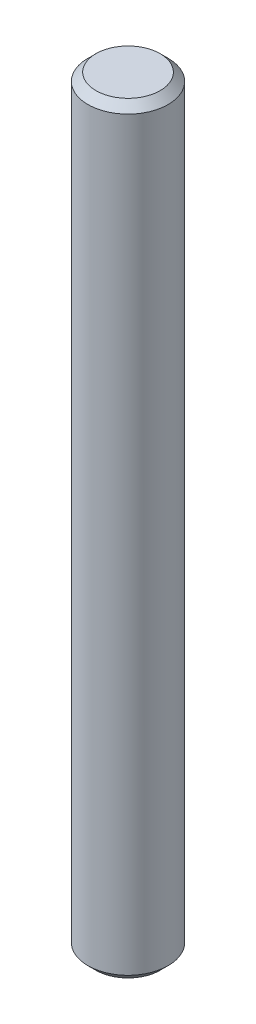
ISO-10303-21;
HEADER;
FILE_DESCRIPTION(('STEP AP214'),'2;1');
FILE_NAME('part.step','',(''),(''),'','','');
FILE_SCHEMA(('AUTOMOTIVE_DESIGN { 1 0 10303 214 1 1 1 1 }'));
ENDSEC;
DATA;
#1=APPLICATION_CONTEXT('core data for automotive mechanical design processes');
#2=APPLICATION_PROTOCOL_DEFINITION('international standard','automotive_design',2000,#1);
#3=PRODUCT_CONTEXT('',#1,'mechanical');
#4=PRODUCT('Part','Part','',(#3));
#5=PRODUCT_RELATED_PRODUCT_CATEGORY('part','',(#4));
#6=PRODUCT_DEFINITION_FORMATION('','',#4);
#7=PRODUCT_DEFINITION_CONTEXT('part definition',#1,'design');
#8=PRODUCT_DEFINITION('design','',#6,#7);
#9=PRODUCT_DEFINITION_SHAPE('','',#8);
#10=(LENGTH_UNIT() NAMED_UNIT(*) SI_UNIT(.MILLI.,.METRE.));
#11=(NAMED_UNIT(*) PLANE_ANGLE_UNIT() SI_UNIT($,.RADIAN.));
#12=(NAMED_UNIT(*) SI_UNIT($,.STERADIAN.) SOLID_ANGLE_UNIT());
#13=UNCERTAINTY_MEASURE_WITH_UNIT(LENGTH_MEASURE(1.E-05),#10,'distance_accuracy_value','');
#14=(GEOMETRIC_REPRESENTATION_CONTEXT(3) GLOBAL_UNCERTAINTY_ASSIGNED_CONTEXT((#13)) GLOBAL_UNIT_ASSIGNED_CONTEXT((#10,
#11,#12)) REPRESENTATION_CONTEXT('',''));
#15=CARTESIAN_POINT('',(0.,0.,0.));
#16=DIRECTION('',(0.,0.,1.));
#17=DIRECTION('',(1.,0.,0.));
#18=AXIS2_PLACEMENT_3D('',#15,#16,#17);
#19=CARTESIAN_POINT('',(-1107.44,320.675,-1549.4));
#20=DIRECTION('',(0.,-1.,0.));
#21=DIRECTION('',(0.,0.,-1.));
#22=AXIS2_PLACEMENT_3D('',#19,#20,#21);
#23=CYLINDRICAL_SURFACE('',#22,3.17499999999983);
#24=CARTESIAN_POINT('',(-1107.44,260.985,-1549.4));
#25=DIRECTION('',(0.,1.,0.));
#26=DIRECTION('',(0.,0.,1.));
#27=AXIS2_PLACEMENT_3D('',#24,#25,#26);
#28=CIRCLE('',#27,3.17499999999983);
#29=CARTESIAN_POINT('',(-1107.44,260.985,-1552.575));
#30=VERTEX_POINT('',#29);
#31=EDGE_CURVE('E42',#30,#30,#28,.T.);
#32=CARTESIAN_POINT('',(-1107.44,320.04,-1549.4));
#33=DIRECTION('',(0.,1.,0.));
#34=DIRECTION('',(0.,0.,1.));
#35=AXIS2_PLACEMENT_3D('',#32,#33,#34);
#36=CIRCLE('',#35,3.17499999999983);
#37=CARTESIAN_POINT('',(-1107.44,320.04,-1552.575));
#38=VERTEX_POINT('',#37);
#39=EDGE_CURVE('E46',#38,#38,#36,.F.);
#40=CARTESIAN_POINT('',(-1107.44,260.985,-1552.575));
#41=CARTESIAN_POINT('',(-1107.44,261.60015625,-1552.575));
#42=CARTESIAN_POINT('',(-1107.44,262.2153125,-1552.575));
#43=CARTESIAN_POINT('',(-1107.44,263.445625,-1552.575));
#44=CARTESIAN_POINT('',(-1107.44,264.06078125,-1552.575));
#45=CARTESIAN_POINT('',(-1107.44,265.29109375,-1552.575));
#46=CARTESIAN_POINT('',(-1107.44,265.90625,-1552.575));
#47=CARTESIAN_POINT('',(-1107.44,267.1365625,-1552.575));
#48=CARTESIAN_POINT('',(-1107.44,267.75171875,-1552.575));
#49=CARTESIAN_POINT('',(-1107.44,268.98203125,-1552.575));
#50=CARTESIAN_POINT('',(-1107.44,269.5971875,-1552.575));
#51=CARTESIAN_POINT('',(-1107.44,270.8275,-1552.575));
#52=CARTESIAN_POINT('',(-1107.44,271.44265625,-1552.575));
#53=CARTESIAN_POINT('',(-1107.44,272.67296875,-1552.575));
#54=CARTESIAN_POINT('',(-1107.44,273.288125,-1552.575));
#55=CARTESIAN_POINT('',(-1107.44,274.5184375,-1552.575));
#56=CARTESIAN_POINT('',(-1107.44,275.13359375,-1552.575));
#57=CARTESIAN_POINT('',(-1107.44,276.36390625,-1552.575));
#58=CARTESIAN_POINT('',(-1107.44,276.9790625,-1552.575));
#59=CARTESIAN_POINT('',(-1107.44,278.209375,-1552.575));
#60=CARTESIAN_POINT('',(-1107.44,278.82453125,-1552.575));
#61=CARTESIAN_POINT('',(-1107.44,280.05484375,-1552.575));
#62=CARTESIAN_POINT('',(-1107.44,280.67,-1552.575));
#63=CARTESIAN_POINT('',(-1107.44,281.9003125,-1552.575));
#64=CARTESIAN_POINT('',(-1107.44,282.51546875,-1552.575));
#65=CARTESIAN_POINT('',(-1107.44,283.74578125,-1552.575));
#66=CARTESIAN_POINT('',(-1107.44,284.3609375,-1552.575));
#67=CARTESIAN_POINT('',(-1107.44,285.59125,-1552.575));
#68=CARTESIAN_POINT('',(-1107.44,286.20640625,-1552.575));
#69=CARTESIAN_POINT('',(-1107.44,287.43671875,-1552.575));
#70=CARTESIAN_POINT('',(-1107.44,288.051875,-1552.575));
#71=CARTESIAN_POINT('',(-1107.44,289.2821875,-1552.575));
#72=CARTESIAN_POINT('',(-1107.44,289.89734375,-1552.575));
#73=CARTESIAN_POINT('',(-1107.44,291.12765625,-1552.575));
#74=CARTESIAN_POINT('',(-1107.44,291.7428125,-1552.575));
#75=CARTESIAN_POINT('',(-1107.44,292.973125,-1552.575));
#76=CARTESIAN_POINT('',(-1107.44,293.58828125,-1552.575));
#77=CARTESIAN_POINT('',(-1107.44,294.81859375,-1552.575));
#78=CARTESIAN_POINT('',(-1107.44,295.43375,-1552.575));
#79=CARTESIAN_POINT('',(-1107.44,296.6640625,-1552.575));
#80=CARTESIAN_POINT('',(-1107.44,297.27921875,-1552.575));
#81=CARTESIAN_POINT('',(-1107.44,298.50953125,-1552.575));
#82=CARTESIAN_POINT('',(-1107.44,299.1246875,-1552.575));
#83=CARTESIAN_POINT('',(-1107.44,300.355,-1552.575));
#84=CARTESIAN_POINT('',(-1107.44,300.97015625,-1552.575));
#85=CARTESIAN_POINT('',(-1107.44,302.20046875,-1552.575));
#86=CARTESIAN_POINT('',(-1107.44,302.815625,-1552.575));
#87=CARTESIAN_POINT('',(-1107.44,304.0459375,-1552.575));
#88=CARTESIAN_POINT('',(-1107.44,304.66109375,-1552.575));
#89=CARTESIAN_POINT('',(-1107.44,305.89140625,-1552.575));
#90=CARTESIAN_POINT('',(-1107.44,306.5065625,-1552.575));
#91=CARTESIAN_POINT('',(-1107.44,307.736875,-1552.575));
#92=CARTESIAN_POINT('',(-1107.44,308.35203125,-1552.575));
#93=CARTESIAN_POINT('',(-1107.44,309.58234375,-1552.575));
#94=CARTESIAN_POINT('',(-1107.44,310.1975,-1552.575));
#95=CARTESIAN_POINT('',(-1107.44,311.4278125,-1552.575));
#96=CARTESIAN_POINT('',(-1107.44,312.04296875,-1552.575));
#97=CARTESIAN_POINT('',(-1107.44,313.27328125,-1552.575));
#98=CARTESIAN_POINT('',(-1107.44,313.8884375,-1552.575));
#99=CARTESIAN_POINT('',(-1107.44,315.11875,-1552.575));
#100=CARTESIAN_POINT('',(-1107.44,315.73390625,-1552.575));
#101=CARTESIAN_POINT('',(-1107.44,316.96421875,-1552.575));
#102=CARTESIAN_POINT('',(-1107.44,317.579375,-1552.575));
#103=CARTESIAN_POINT('',(-1107.44,318.8096875,-1552.575));
#104=CARTESIAN_POINT('',(-1107.44,319.42484375,-1552.575));
#105=CARTESIAN_POINT('',(-1107.44,320.04,-1552.575));
#106=B_SPLINE_CURVE_WITH_KNOTS('',3,(#40,#41,#42,#43,#44,#45,#46,#47,#48,#49,#50,#51,#52,#53,
#54,#55,#56,#57,#58,#59,#60,#61,#62,#63,#64,#65,#66,#67,#68,#69,#70,#71,#72,#73,#74,#75,#76,#77,
#78,#79,#80,#81,#82,#83,#84,#85,#86,#87,#88,#89,#90,#91,#92,#93,#94,#95,#96,#97,#98,#99,#100,
#101,#102,#103,#104,#105),.UNSPECIFIED.,.F.,.F.,(4,2,2,2,2,2,2,2,2,2,2,2,2,2,2,2,2,2,2,2,2,2,2,
2,2,2,2,2,2,2,2,2,4),(0.,1.84546874999997,3.69093749999999,5.53640625000001,7.38187500000004,
9.22734375000006,11.0728125,12.9182812500001,14.7637500000001,16.6092187500001,18.4546875000001,
20.3001562500001,22.1456250000001,23.9910937500001,25.8365625000002,27.6820312500001,
29.5275000000002,31.3729687500002,33.2184375000002,35.0639062500002,36.9093750000002,
38.7548437500002,40.6003125000002,42.4457812500003,44.2912500000002,46.1367187500002,
47.9821875000003,49.8276562500003,51.6731250000003,53.5185937500003,55.3640625000003,
57.2095312500003,59.0550000000004),.UNSPECIFIED.);
#107=EDGE_CURVE('BSEAM31',#30,#38,#106,.T.);
#108=ORIENTED_EDGE('',*,*,#31,.T.);
#109=ORIENTED_EDGE('',*,*,#39,.T.);
#110=ORIENTED_EDGE('',*,*,#107,.T.);
#111=ORIENTED_EDGE('',*,*,#107,.F.);
#112=EDGE_LOOP('',(#108,#110,#109,#111));
#113=FACE_BOUND('',#112,.T.);
#114=ADVANCED_FACE('F31',(#113),#23,.T.);
#115=CARTESIAN_POINT('',(-1107.44,320.675,-1549.4));
#116=DIRECTION('',(0.,1.,0.));
#117=DIRECTION('',(0.,0.,1.));
#118=AXIS2_PLACEMENT_3D('',#115,#116,#117);
#119=PLANE('',#118);
#120=CARTESIAN_POINT('',(-1107.44,320.675,-1549.4));
#121=DIRECTION('',(0.,1.,0.));
#122=DIRECTION('',(0.,0.,1.));
#123=AXIS2_PLACEMENT_3D('',#120,#121,#122);
#124=CIRCLE('',#123,2.53999999999999);
#125=CARTESIAN_POINT('',(-1107.44,320.675,-1546.86));
#126=VERTEX_POINT('',#125);
#127=EDGE_CURVE('E10',#126,#126,#124,.T.);
#128=ORIENTED_EDGE('',*,*,#127,.T.);
#129=EDGE_LOOP('',(#128));
#130=FACE_BOUND('',#129,.T.);
#131=ADVANCED_FACE('F62',(#130),#119,.T.);
#132=CARTESIAN_POINT('',(-1107.44,260.35,-1549.4));
#133=DIRECTION('',(0.,1.,0.));
#134=DIRECTION('',(0.,0.,1.));
#135=AXIS2_PLACEMENT_3D('',#132,#133,#134);
#136=PLANE('',#135);
#137=CARTESIAN_POINT('',(-1107.44,260.35,-1549.4));
#138=DIRECTION('',(0.,1.,0.));
#139=DIRECTION('',(0.,0.,1.));
#140=AXIS2_PLACEMENT_3D('',#137,#138,#139);
#141=CIRCLE('',#140,2.53999999999999);
#142=CARTESIAN_POINT('',(-1107.44,260.35,-1546.86));
#143=VERTEX_POINT('',#142);
#144=EDGE_CURVE('E38',#143,#143,#141,.F.);
#145=ORIENTED_EDGE('',*,*,#144,.T.);
#146=EDGE_LOOP('',(#145));
#147=FACE_BOUND('',#146,.T.);
#148=ADVANCED_FACE('F59',(#147),#136,.F.);
#149=CARTESIAN_POINT('',(-1107.44,260.985,-1549.4));
#150=DIRECTION('',(0.,1.,0.));
#151=DIRECTION('',(0.,0.,1.));
#152=AXIS2_PLACEMENT_3D('',#149,#150,#151);
#153=CONICAL_SURFACE('',#152,3.17499999999983,0.785398163397504);
#154=ORIENTED_EDGE('',*,*,#144,.F.);
#155=EDGE_LOOP('',(#154));
#156=FACE_BOUND('',#155,.T.);
#157=ORIENTED_EDGE('',*,*,#31,.F.);
#158=EDGE_LOOP('',(#157));
#159=FACE_BOUND('',#158,.T.);
#160=ADVANCED_FACE('F55',(#156,#159),#153,.T.);
#161=CARTESIAN_POINT('',(-1107.44,320.675,-1549.4));
#162=DIRECTION('',(0.,-1.,0.));
#163=DIRECTION('',(0.,0.,-1.));
#164=AXIS2_PLACEMENT_3D('',#161,#162,#163);
#165=CONICAL_SURFACE('',#164,2.53999999999999,0.785398163397417);
#166=ORIENTED_EDGE('',*,*,#39,.F.);
#167=EDGE_LOOP('',(#166));
#168=FACE_BOUND('',#167,.T.);
#169=ORIENTED_EDGE('',*,*,#127,.F.);
#170=EDGE_LOOP('',(#169));
#171=FACE_BOUND('',#170,.T.);
#172=ADVANCED_FACE('F33',(#168,#171),#165,.T.);
#173=CLOSED_SHELL('',(#114,#131,#148,#160,#172));
#174=MANIFOLD_SOLID_BREP('B2',#173);
#175=ADVANCED_BREP_SHAPE_REPRESENTATION('',(#18,#174),#14);
#176=SHAPE_DEFINITION_REPRESENTATION(#9,#175);
ENDSEC;
END-ISO-10303-21;
